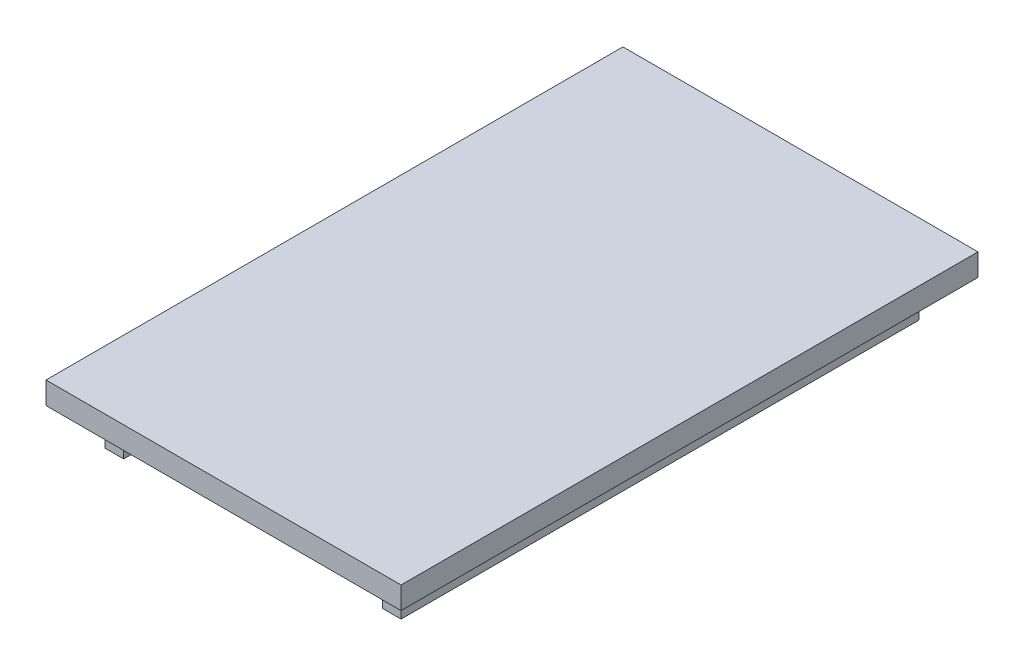
ISO-10303-21;
HEADER;
FILE_DESCRIPTION(('STEP AP214'),'2;1');
FILE_NAME('part.step','',(''),(''),'','','');
FILE_SCHEMA(('AUTOMOTIVE_DESIGN { 1 0 10303 214 1 1 1 1 }'));
ENDSEC;
DATA;
#1=APPLICATION_CONTEXT('core data for automotive mechanical design processes');
#2=APPLICATION_PROTOCOL_DEFINITION('international standard','automotive_design',2000,#1);
#3=PRODUCT_CONTEXT('',#1,'mechanical');
#4=PRODUCT('Part','Part','',(#3));
#5=PRODUCT_RELATED_PRODUCT_CATEGORY('part','',(#4));
#6=PRODUCT_DEFINITION_FORMATION('','',#4);
#7=PRODUCT_DEFINITION_CONTEXT('part definition',#1,'design');
#8=PRODUCT_DEFINITION('design','',#6,#7);
#9=PRODUCT_DEFINITION_SHAPE('','',#8);
#10=(LENGTH_UNIT() NAMED_UNIT(*) SI_UNIT(.MILLI.,.METRE.));
#11=(NAMED_UNIT(*) PLANE_ANGLE_UNIT() SI_UNIT($,.RADIAN.));
#12=(NAMED_UNIT(*) SI_UNIT($,.STERADIAN.) SOLID_ANGLE_UNIT());
#13=UNCERTAINTY_MEASURE_WITH_UNIT(LENGTH_MEASURE(1.E-05),#10,'distance_accuracy_value','');
#14=(GEOMETRIC_REPRESENTATION_CONTEXT(3) GLOBAL_UNCERTAINTY_ASSIGNED_CONTEXT((#13)) GLOBAL_UNIT_ASSIGNED_CONTEXT((#10,
#11,#12)) REPRESENTATION_CONTEXT('',''));
#15=CARTESIAN_POINT('',(0.,0.,0.));
#16=DIRECTION('',(0.,0.,1.));
#17=DIRECTION('',(1.,0.,0.));
#18=AXIS2_PLACEMENT_3D('',#15,#16,#17);
#19=CARTESIAN_POINT('',(0.,5.,0.));
#20=DIRECTION('',(0.,0.,1.));
#21=DIRECTION('',(1.,0.,0.));
#22=AXIS2_PLACEMENT_3D('',#19,#20,#21);
#23=PLANE('',#22);
#24=DIRECTION('',(0.,-1.,0.));
#25=VECTOR('',#24,1.);
#26=CARTESIAN_POINT('',(-2.49999999999998,5.,0.));
#27=LINE('',#26,#25);
#28=CARTESIAN_POINT('',(-2.49999999999998,5.,0.));
#29=VERTEX_POINT('',#28);
#30=CARTESIAN_POINT('',(-2.49999999999998,0.,0.));
#31=VERTEX_POINT('',#30);
#32=EDGE_CURVE('E145',#29,#31,#27,.T.);
#33=ORIENTED_EDGE('',*,*,#32,.F.);
#34=DIRECTION('',(-1.,0.,0.));
#35=VECTOR('',#34,1.);
#36=CARTESIAN_POINT('',(0.,5.,0.));
#37=LINE('',#36,#35);
#38=CARTESIAN_POINT('',(0.,5.,0.));
#39=VERTEX_POINT('',#38);
#40=EDGE_CURVE('E96',#39,#29,#37,.T.);
#41=ORIENTED_EDGE('',*,*,#40,.F.);
#42=DIRECTION('',(0.,-1.,0.));
#43=VECTOR('',#42,1.);
#44=CARTESIAN_POINT('',(0.,5.,0.));
#45=LINE('',#44,#43);
#46=CARTESIAN_POINT('',(0.,0.,0.));
#47=VERTEX_POINT('',#46);
#48=EDGE_CURVE('E11',#39,#47,#45,.T.);
#49=ORIENTED_EDGE('',*,*,#48,.T.);
#50=DIRECTION('',(-1.,0.,0.));
#51=VECTOR('',#50,1.);
#52=CARTESIAN_POINT('',(0.,0.,0.));
#53=LINE('',#52,#51);
#54=EDGE_CURVE('E154',#47,#31,#53,.T.);
#55=ORIENTED_EDGE('',*,*,#54,.T.);
#56=EDGE_LOOP('',(#33,#41,#49,#55));
#57=FACE_BOUND('',#56,.T.);
#58=ADVANCED_FACE('F45',(#57),#23,.F.);
#59=CARTESIAN_POINT('',(0.,5.,70.));
#60=DIRECTION('',(0.,0.,-1.));
#61=DIRECTION('',(-1.,0.,0.));
#62=AXIS2_PLACEMENT_3D('',#59,#60,#61);
#63=PLANE('',#62);
#64=DIRECTION('',(0.,-1.,0.));
#65=VECTOR('',#64,1.);
#66=CARTESIAN_POINT('',(-2.49999999999999,5.,70.));
#67=LINE('',#66,#65);
#68=CARTESIAN_POINT('',(-2.49999999999999,5.,70.));
#69=VERTEX_POINT('',#68);
#70=CARTESIAN_POINT('',(-2.49999999999999,0.,70.));
#71=VERTEX_POINT('',#70);
#72=EDGE_CURVE('E147',#69,#71,#67,.T.);
#73=ORIENTED_EDGE('',*,*,#72,.T.);
#74=DIRECTION('',(1.,0.,0.));
#75=VECTOR('',#74,1.);
#76=CARTESIAN_POINT('',(0.,0.,70.));
#77=LINE('',#76,#75);
#78=CARTESIAN_POINT('',(0.,0.,70.));
#79=VERTEX_POINT('',#78);
#80=EDGE_CURVE('E91',#71,#79,#77,.T.);
#81=ORIENTED_EDGE('',*,*,#80,.T.);
#82=DIRECTION('',(0.,-1.,0.));
#83=VECTOR('',#82,1.);
#84=CARTESIAN_POINT('',(0.,5.,70.));
#85=LINE('',#84,#83);
#86=CARTESIAN_POINT('',(0.,5.,70.));
#87=VERTEX_POINT('',#86);
#88=EDGE_CURVE('E178',#87,#79,#85,.T.);
#89=ORIENTED_EDGE('',*,*,#88,.F.);
#90=DIRECTION('',(1.,0.,0.));
#91=VECTOR('',#90,1.);
#92=CARTESIAN_POINT('',(0.,5.,70.));
#93=LINE('',#92,#91);
#94=EDGE_CURVE('E169',#69,#87,#93,.T.);
#95=ORIENTED_EDGE('',*,*,#94,.F.);
#96=EDGE_LOOP('',(#73,#81,#89,#95));
#97=FACE_BOUND('',#96,.T.);
#98=ADVANCED_FACE('F298',(#97),#63,.F.);
#99=CARTESIAN_POINT('',(0.,0.,0.));
#100=DIRECTION('',(0.,-1.,0.));
#101=DIRECTION('',(0.,0.,-1.));
#102=AXIS2_PLACEMENT_3D('',#99,#100,#101);
#103=PLANE('',#102);
#104=ORIENTED_EDGE('',*,*,#80,.F.);
#105=DIRECTION('',(0.,0.,-1.));
#106=VECTOR('',#105,1.);
#107=CARTESIAN_POINT('',(-2.49999999999999,0.,70.));
#108=LINE('',#107,#106);
#109=EDGE_CURVE('E318',#71,#31,#108,.T.);
#110=ORIENTED_EDGE('',*,*,#109,.T.);
#111=ORIENTED_EDGE('',*,*,#54,.F.);
#112=DIRECTION('',(0.,0.,-1.));
#113=VECTOR('',#112,1.);
#114=CARTESIAN_POINT('',(0.,0.,0.));
#115=LINE('',#114,#113);
#116=EDGE_CURVE('E179',#79,#47,#115,.T.);
#117=ORIENTED_EDGE('',*,*,#116,.F.);
#118=EDGE_LOOP('',(#104,#110,#111,#117));
#119=FACE_BOUND('',#118,.T.);
#120=ADVANCED_FACE('F302',(#119),#103,.T.);
#121=CARTESIAN_POINT('',(0.,5.,0.));
#122=DIRECTION('',(-1.,0.,0.));
#123=DIRECTION('',(0.,0.,1.));
#124=AXIS2_PLACEMENT_3D('',#121,#122,#123);
#125=PLANE('',#124);
#126=ORIENTED_EDGE('',*,*,#116,.T.);
#127=ORIENTED_EDGE('',*,*,#48,.F.);
#128=DIRECTION('',(0.,0.,-1.));
#129=VECTOR('',#128,1.);
#130=CARTESIAN_POINT('',(0.,5.,0.));
#131=LINE('',#130,#129);
#132=EDGE_CURVE('E161',#87,#39,#131,.T.);
#133=ORIENTED_EDGE('',*,*,#132,.F.);
#134=ORIENTED_EDGE('',*,*,#88,.T.);
#135=EDGE_LOOP('',(#126,#127,#133,#134));
#136=FACE_BOUND('',#135,.T.);
#137=ADVANCED_FACE('F47',(#136),#125,.F.);
#138=CARTESIAN_POINT('',(-37.5,5.,0.));
#139=VERTEX_POINT('',#138);
#140=CARTESIAN_POINT('',(-40.,5.,0.));
#141=VERTEX_POINT('',#140);
#142=EDGE_CURVE('E164',#139,#141,#37,.T.);
#143=ORIENTED_EDGE('',*,*,#142,.F.);
#144=DIRECTION('',(0.,-1.,0.));
#145=VECTOR('',#144,1.);
#146=CARTESIAN_POINT('',(-37.5,5.,0.));
#147=LINE('',#146,#145);
#148=CARTESIAN_POINT('',(-37.5,0.,0.));
#149=VERTEX_POINT('',#148);
#150=EDGE_CURVE('E217',#139,#149,#147,.T.);
#151=ORIENTED_EDGE('',*,*,#150,.T.);
#152=CARTESIAN_POINT('',(-40.,0.,0.));
#153=VERTEX_POINT('',#152);
#154=EDGE_CURVE('E183',#149,#153,#53,.T.);
#155=ORIENTED_EDGE('',*,*,#154,.T.);
#156=DIRECTION('',(0.,-1.,0.));
#157=VECTOR('',#156,1.);
#158=CARTESIAN_POINT('',(-40.,5.,0.));
#159=LINE('',#158,#157);
#160=EDGE_CURVE('E54',#141,#153,#159,.T.);
#161=ORIENTED_EDGE('',*,*,#160,.F.);
#162=EDGE_LOOP('',(#143,#151,#155,#161));
#163=FACE_BOUND('',#162,.T.);
#164=ADVANCED_FACE('F216',(#163),#23,.F.);
#165=CARTESIAN_POINT('',(-40.,5.,0.));
#166=DIRECTION('',(1.,0.,0.));
#167=DIRECTION('',(0.,0.,-1.));
#168=AXIS2_PLACEMENT_3D('',#165,#166,#167);
#169=PLANE('',#168);
#170=DIRECTION('',(0.,0.,1.));
#171=VECTOR('',#170,1.);
#172=CARTESIAN_POINT('',(-40.,0.,0.));
#173=LINE('',#172,#171);
#174=CARTESIAN_POINT('',(-40.,0.,70.));
#175=VERTEX_POINT('',#174);
#176=EDGE_CURVE('E187',#153,#175,#173,.T.);
#177=ORIENTED_EDGE('',*,*,#176,.T.);
#178=DIRECTION('',(0.,-1.,0.));
#179=VECTOR('',#178,1.);
#180=CARTESIAN_POINT('',(-40.,5.,70.));
#181=LINE('',#180,#179);
#182=CARTESIAN_POINT('',(-40.,5.,70.));
#183=VERTEX_POINT('',#182);
#184=EDGE_CURVE('E70',#183,#175,#181,.T.);
#185=ORIENTED_EDGE('',*,*,#184,.F.);
#186=DIRECTION('',(0.,0.,1.));
#187=VECTOR('',#186,1.);
#188=CARTESIAN_POINT('',(-40.,5.,0.));
#189=LINE('',#188,#187);
#190=EDGE_CURVE('E163',#141,#183,#189,.T.);
#191=ORIENTED_EDGE('',*,*,#190,.F.);
#192=ORIENTED_EDGE('',*,*,#160,.T.);
#193=EDGE_LOOP('',(#177,#185,#191,#192));
#194=FACE_BOUND('',#193,.T.);
#195=ADVANCED_FACE('F201',(#194),#169,.F.);
#196=CARTESIAN_POINT('',(-37.5,0.,70.));
#197=VERTEX_POINT('',#196);
#198=EDGE_CURVE('E190',#175,#197,#77,.T.);
#199=ORIENTED_EDGE('',*,*,#198,.T.);
#200=DIRECTION('',(0.,-1.,0.));
#201=VECTOR('',#200,1.);
#202=CARTESIAN_POINT('',(-37.5,5.,70.));
#203=LINE('',#202,#201);
#204=CARTESIAN_POINT('',(-37.5,5.,70.));
#205=VERTEX_POINT('',#204);
#206=EDGE_CURVE('E212',#205,#197,#203,.T.);
#207=ORIENTED_EDGE('',*,*,#206,.F.);
#208=EDGE_CURVE('E174',#183,#205,#93,.T.);
#209=ORIENTED_EDGE('',*,*,#208,.F.);
#210=ORIENTED_EDGE('',*,*,#184,.T.);
#211=EDGE_LOOP('',(#199,#207,#209,#210));
#212=FACE_BOUND('',#211,.T.);
#213=ADVANCED_FACE('F211',(#212),#63,.F.);
#214=DIRECTION('',(0.,0.,-1.));
#215=VECTOR('',#214,1.);
#216=CARTESIAN_POINT('',(-37.5,0.,70.));
#217=LINE('',#216,#215);
#218=EDGE_CURVE('E151',#197,#149,#217,.T.);
#219=ORIENTED_EDGE('',*,*,#218,.F.);
#220=ORIENTED_EDGE('',*,*,#198,.F.);
#221=ORIENTED_EDGE('',*,*,#176,.F.);
#222=ORIENTED_EDGE('',*,*,#154,.F.);
#223=EDGE_LOOP('',(#219,#220,#221,#222));
#224=FACE_BOUND('',#223,.T.);
#225=ADVANCED_FACE('F208',(#224),#103,.T.);
#226=CARTESIAN_POINT('',(4.,8.,74.));
#227=DIRECTION('',(-1.,0.,0.));
#228=DIRECTION('',(0.,0.,1.));
#229=AXIS2_PLACEMENT_3D('',#226,#227,#228);
#230=PLANE('',#229);
#231=DIRECTION('',(0.,0.,-1.));
#232=VECTOR('',#231,1.);
#233=CARTESIAN_POINT('',(4.,5.,74.));
#234=LINE('',#233,#232);
#235=CARTESIAN_POINT('',(4.,5.,74.));
#236=VERTEX_POINT('',#235);
#237=CARTESIAN_POINT('',(4.,5.,-4.));
#238=VERTEX_POINT('',#237);
#239=EDGE_CURVE('E220',#236,#238,#234,.T.);
#240=ORIENTED_EDGE('',*,*,#239,.T.);
#241=DIRECTION('',(0.,-1.,0.));
#242=VECTOR('',#241,1.);
#243=CARTESIAN_POINT('',(4.,8.,-4.));
#244=LINE('',#243,#242);
#245=CARTESIAN_POINT('',(4.,8.,-4.));
#246=VERTEX_POINT('',#245);
#247=EDGE_CURVE('E184',#246,#238,#244,.T.);
#248=ORIENTED_EDGE('',*,*,#247,.F.);
#249=DIRECTION('',(0.,0.,-1.));
#250=VECTOR('',#249,1.);
#251=CARTESIAN_POINT('',(4.,8.,74.));
#252=LINE('',#251,#250);
#253=CARTESIAN_POINT('',(4.,8.,74.));
#254=VERTEX_POINT('',#253);
#255=EDGE_CURVE('E233',#254,#246,#252,.T.);
#256=ORIENTED_EDGE('',*,*,#255,.F.);
#257=DIRECTION('',(0.,-1.,0.));
#258=VECTOR('',#257,1.);
#259=CARTESIAN_POINT('',(4.,8.,74.));
#260=LINE('',#259,#258);
#261=EDGE_CURVE('E246',#254,#236,#260,.T.);
#262=ORIENTED_EDGE('',*,*,#261,.T.);
#263=EDGE_LOOP('',(#240,#248,#256,#262));
#264=FACE_BOUND('',#263,.T.);
#265=ADVANCED_FACE('F274',(#264),#230,.F.);
#266=CARTESIAN_POINT('',(-44.,8.,-4.));
#267=DIRECTION('',(0.,0.,1.));
#268=DIRECTION('',(1.,0.,0.));
#269=AXIS2_PLACEMENT_3D('',#266,#267,#268);
#270=PLANE('',#269);
#271=DIRECTION('',(-1.,0.,0.));
#272=VECTOR('',#271,1.);
#273=CARTESIAN_POINT('',(-44.,5.,-4.));
#274=LINE('',#273,#272);
#275=CARTESIAN_POINT('',(-44.,5.,-4.));
#276=VERTEX_POINT('',#275);
#277=EDGE_CURVE('E225',#238,#276,#274,.T.);
#278=ORIENTED_EDGE('',*,*,#277,.T.);
#279=DIRECTION('',(0.,-1.,0.));
#280=VECTOR('',#279,1.);
#281=CARTESIAN_POINT('',(-44.,8.,-4.));
#282=LINE('',#281,#280);
#283=CARTESIAN_POINT('',(-44.,8.,-4.));
#284=VERTEX_POINT('',#283);
#285=EDGE_CURVE('E262',#284,#276,#282,.T.);
#286=ORIENTED_EDGE('',*,*,#285,.F.);
#287=DIRECTION('',(-1.,0.,0.));
#288=VECTOR('',#287,1.);
#289=CARTESIAN_POINT('',(-44.,8.,-4.));
#290=LINE('',#289,#288);
#291=EDGE_CURVE('E237',#246,#284,#290,.T.);
#292=ORIENTED_EDGE('',*,*,#291,.F.);
#293=ORIENTED_EDGE('',*,*,#247,.T.);
#294=EDGE_LOOP('',(#278,#286,#292,#293));
#295=FACE_BOUND('',#294,.T.);
#296=ADVANCED_FACE('F269',(#295),#270,.F.);
#297=CARTESIAN_POINT('',(-44.,8.,74.));
#298=DIRECTION('',(1.,0.,0.));
#299=DIRECTION('',(0.,0.,-1.));
#300=AXIS2_PLACEMENT_3D('',#297,#298,#299);
#301=PLANE('',#300);
#302=DIRECTION('',(0.,0.,1.));
#303=VECTOR('',#302,1.);
#304=CARTESIAN_POINT('',(-44.,5.,74.));
#305=LINE('',#304,#303);
#306=CARTESIAN_POINT('',(-44.,5.,74.));
#307=VERTEX_POINT('',#306);
#308=EDGE_CURVE('E250',#276,#307,#305,.T.);
#309=ORIENTED_EDGE('',*,*,#308,.T.);
#310=DIRECTION('',(0.,-1.,0.));
#311=VECTOR('',#310,1.);
#312=CARTESIAN_POINT('',(-44.,8.,74.));
#313=LINE('',#312,#311);
#314=CARTESIAN_POINT('',(-44.,8.,74.));
#315=VERTEX_POINT('',#314);
#316=EDGE_CURVE('E258',#315,#307,#313,.T.);
#317=ORIENTED_EDGE('',*,*,#316,.F.);
#318=DIRECTION('',(0.,0.,1.));
#319=VECTOR('',#318,1.);
#320=CARTESIAN_POINT('',(-44.,8.,74.));
#321=LINE('',#320,#319);
#322=EDGE_CURVE('E241',#284,#315,#321,.T.);
#323=ORIENTED_EDGE('',*,*,#322,.F.);
#324=ORIENTED_EDGE('',*,*,#285,.T.);
#325=EDGE_LOOP('',(#309,#317,#323,#324));
#326=FACE_BOUND('',#325,.T.);
#327=ADVANCED_FACE('F280',(#326),#301,.F.);
#328=CARTESIAN_POINT('',(-44.,8.,74.));
#329=DIRECTION('',(0.,0.,-1.));
#330=DIRECTION('',(-1.,0.,0.));
#331=AXIS2_PLACEMENT_3D('',#328,#329,#330);
#332=PLANE('',#331);
#333=DIRECTION('',(1.,0.,0.));
#334=VECTOR('',#333,1.);
#335=CARTESIAN_POINT('',(-44.,5.,74.));
#336=LINE('',#335,#334);
#337=EDGE_CURVE('E238',#307,#236,#336,.T.);
#338=ORIENTED_EDGE('',*,*,#337,.T.);
#339=ORIENTED_EDGE('',*,*,#261,.F.);
#340=DIRECTION('',(1.,0.,0.));
#341=VECTOR('',#340,1.);
#342=CARTESIAN_POINT('',(-44.,8.,74.));
#343=LINE('',#342,#341);
#344=EDGE_CURVE('E244',#315,#254,#343,.T.);
#345=ORIENTED_EDGE('',*,*,#344,.F.);
#346=ORIENTED_EDGE('',*,*,#316,.T.);
#347=EDGE_LOOP('',(#338,#339,#345,#346));
#348=FACE_BOUND('',#347,.T.);
#349=ADVANCED_FACE('F284',(#348),#332,.F.);
#350=CARTESIAN_POINT('',(0.,8.,0.));
#351=DIRECTION('',(0.,-1.,0.));
#352=DIRECTION('',(0.,0.,-1.));
#353=AXIS2_PLACEMENT_3D('',#350,#351,#352);
#354=PLANE('',#353);
#355=ORIENTED_EDGE('',*,*,#255,.T.);
#356=ORIENTED_EDGE('',*,*,#291,.T.);
#357=ORIENTED_EDGE('',*,*,#322,.T.);
#358=ORIENTED_EDGE('',*,*,#344,.T.);
#359=EDGE_LOOP('',(#355,#356,#357,#358));
#360=FACE_BOUND('',#359,.T.);
#361=ADVANCED_FACE('F286',(#360),#354,.F.);
#362=CARTESIAN_POINT('',(0.,5.,0.));
#363=DIRECTION('',(0.,-1.,0.));
#364=DIRECTION('',(0.,0.,-1.));
#365=AXIS2_PLACEMENT_3D('',#362,#363,#364);
#366=PLANE('',#365);
#367=ORIENTED_EDGE('',*,*,#40,.T.);
#368=DIRECTION('',(0.,0.,-1.));
#369=VECTOR('',#368,1.);
#370=CARTESIAN_POINT('',(-2.49999999999999,5.,70.));
#371=LINE('',#370,#369);
#372=EDGE_CURVE('E61',#69,#29,#371,.T.);
#373=ORIENTED_EDGE('',*,*,#372,.F.);
#374=ORIENTED_EDGE('',*,*,#94,.T.);
#375=ORIENTED_EDGE('',*,*,#132,.T.);
#376=EDGE_LOOP('',(#367,#373,#374,#375));
#377=FACE_BOUND('',#376,.T.);
#378=ORIENTED_EDGE('',*,*,#208,.T.);
#379=DIRECTION('',(0.,0.,-1.));
#380=VECTOR('',#379,1.);
#381=CARTESIAN_POINT('',(-37.5,5.,70.));
#382=LINE('',#381,#380);
#383=EDGE_CURVE('E150',#205,#139,#382,.T.);
#384=ORIENTED_EDGE('',*,*,#383,.T.);
#385=ORIENTED_EDGE('',*,*,#142,.T.);
#386=ORIENTED_EDGE('',*,*,#190,.T.);
#387=EDGE_LOOP('',(#378,#384,#385,#386));
#388=FACE_BOUND('',#387,.T.);
#389=ORIENTED_EDGE('',*,*,#239,.F.);
#390=ORIENTED_EDGE('',*,*,#337,.F.);
#391=ORIENTED_EDGE('',*,*,#308,.F.);
#392=ORIENTED_EDGE('',*,*,#277,.F.);
#393=EDGE_LOOP('',(#389,#390,#391,#392));
#394=FACE_BOUND('',#393,.T.);
#395=ADVANCED_FACE('F158',(#377,#388,#394),#366,.T.);
#396=CARTESIAN_POINT('',(-37.5,5.,70.));
#397=DIRECTION('',(-1.,0.,0.));
#398=DIRECTION('',(0.,0.,1.));
#399=AXIS2_PLACEMENT_3D('',#396,#397,#398);
#400=PLANE('',#399);
#401=ORIENTED_EDGE('',*,*,#218,.T.);
#402=ORIENTED_EDGE('',*,*,#150,.F.);
#403=ORIENTED_EDGE('',*,*,#383,.F.);
#404=ORIENTED_EDGE('',*,*,#206,.T.);
#405=EDGE_LOOP('',(#401,#402,#403,#404));
#406=FACE_BOUND('',#405,.T.);
#407=ADVANCED_FACE('F294',(#406),#400,.F.);
#408=CARTESIAN_POINT('',(-2.49999999999999,5.,70.));
#409=DIRECTION('',(-1.,0.,0.));
#410=DIRECTION('',(0.,0.,1.));
#411=AXIS2_PLACEMENT_3D('',#408,#409,#410);
#412=PLANE('',#411);
#413=ORIENTED_EDGE('',*,*,#109,.F.);
#414=ORIENTED_EDGE('',*,*,#72,.F.);
#415=ORIENTED_EDGE('',*,*,#372,.T.);
#416=ORIENTED_EDGE('',*,*,#32,.T.);
#417=EDGE_LOOP('',(#413,#414,#415,#416));
#418=FACE_BOUND('',#417,.T.);
#419=ADVANCED_FACE('F144',(#418),#412,.T.);
#420=CLOSED_SHELL('',(#58,#98,#120,#137,#164,#195,#213,#225,#265,#296,#327,#349,#361,#395,#407,#419));
#421=MANIFOLD_SOLID_BREP('B2',#420);
#422=ADVANCED_BREP_SHAPE_REPRESENTATION('',(#18,#421),#14);
#423=SHAPE_DEFINITION_REPRESENTATION(#9,#422);
ENDSEC;
END-ISO-10303-21;
